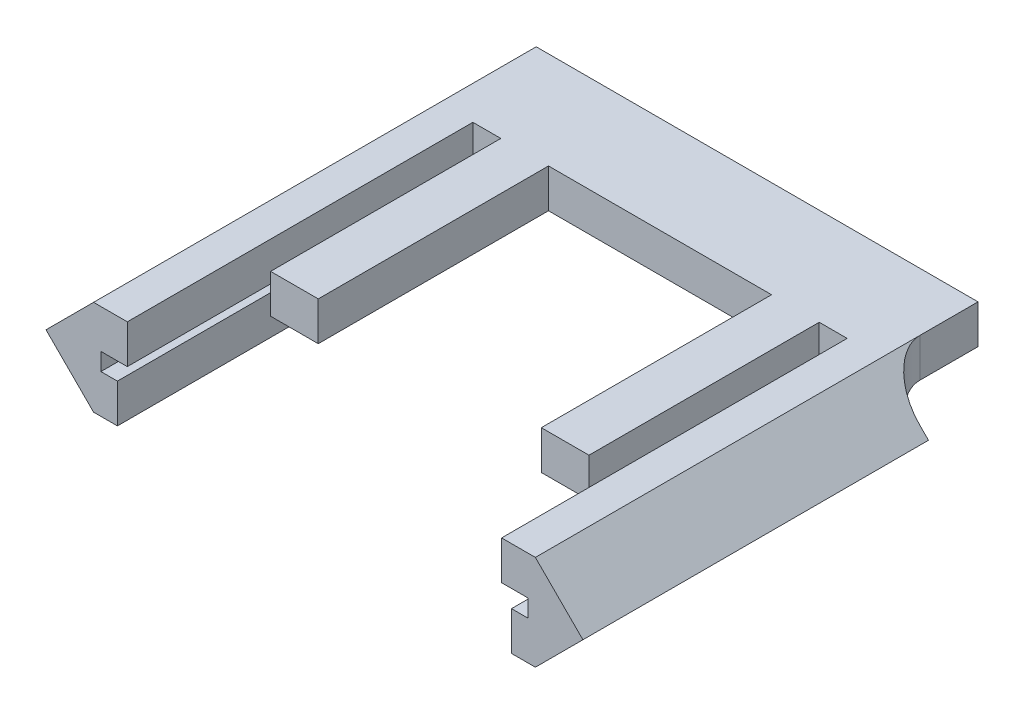
ISO-10303-21;
HEADER;
FILE_DESCRIPTION(('STEP AP214'),'2;1');
FILE_NAME('part.step','',(''),(''),'','','');
FILE_SCHEMA(('AUTOMOTIVE_DESIGN { 1 0 10303 214 1 1 1 1 }'));
ENDSEC;
DATA;
#1=APPLICATION_CONTEXT('core data for automotive mechanical design processes');
#2=APPLICATION_PROTOCOL_DEFINITION('international standard','automotive_design',2000,#1);
#3=PRODUCT_CONTEXT('',#1,'mechanical');
#4=PRODUCT('Part','Part','',(#3));
#5=PRODUCT_RELATED_PRODUCT_CATEGORY('part','',(#4));
#6=PRODUCT_DEFINITION_FORMATION('','',#4);
#7=PRODUCT_DEFINITION_CONTEXT('part definition',#1,'design');
#8=PRODUCT_DEFINITION('design','',#6,#7);
#9=PRODUCT_DEFINITION_SHAPE('','',#8);
#10=(LENGTH_UNIT() NAMED_UNIT(*) SI_UNIT(.MILLI.,.METRE.));
#11=(NAMED_UNIT(*) PLANE_ANGLE_UNIT() SI_UNIT($,.RADIAN.));
#12=(NAMED_UNIT(*) SI_UNIT($,.STERADIAN.) SOLID_ANGLE_UNIT());
#13=UNCERTAINTY_MEASURE_WITH_UNIT(LENGTH_MEASURE(1.E-05),#10,'distance_accuracy_value','');
#14=(GEOMETRIC_REPRESENTATION_CONTEXT(3) GLOBAL_UNCERTAINTY_ASSIGNED_CONTEXT((#13)) GLOBAL_UNIT_ASSIGNED_CONTEXT((#10,
#11,#12)) REPRESENTATION_CONTEXT('',''));
#15=CARTESIAN_POINT('',(0.,0.,0.));
#16=DIRECTION('',(0.,0.,1.));
#17=DIRECTION('',(1.,0.,0.));
#18=AXIS2_PLACEMENT_3D('',#15,#16,#17);
#19=CARTESIAN_POINT('',(0.,0.,0.));
#20=DIRECTION('',(0.,0.,-1.));
#21=DIRECTION('',(-1.,0.,0.));
#22=AXIS2_PLACEMENT_3D('',#19,#20,#21);
#23=PLANE('',#22);
#24=DIRECTION('',(0.,1.,0.));
#25=VECTOR('',#24,1.);
#26=CARTESIAN_POINT('',(26.289,0.,0.));
#27=LINE('',#26,#25);
#28=CARTESIAN_POINT('',(26.289,-2.54,0.));
#29=VERTEX_POINT('',#28);
#30=CARTESIAN_POINT('',(26.289,-1.397,0.));
#31=VERTEX_POINT('',#30);
#32=EDGE_CURVE('E240',#29,#31,#27,.T.);
#33=ORIENTED_EDGE('',*,*,#32,.T.);
#34=DIRECTION('',(-1.,0.,0.));
#35=VECTOR('',#34,1.);
#36=CARTESIAN_POINT('',(27.8491024484277,-1.397,0.));
#37=LINE('',#36,#35);
#38=CARTESIAN_POINT('',(28.9921024484277,-1.397,0.));
#39=VERTEX_POINT('',#38);
#40=EDGE_CURVE('E228',#31,#39,#37,.F.);
#41=ORIENTED_EDGE('',*,*,#40,.T.);
#42=DIRECTION('',(0.707106781186547,0.707106781186548,0.));
#43=VECTOR('',#42,1.);
#44=CARTESIAN_POINT('',(27.8491024484277,-2.54,0.));
#45=LINE('',#44,#43);
#46=CARTESIAN_POINT('',(27.8491024484277,-2.54,0.));
#47=VERTEX_POINT('',#46);
#48=EDGE_CURVE('E277',#47,#39,#45,.T.);
#49=ORIENTED_EDGE('',*,*,#48,.F.);
#50=DIRECTION('',(1.,0.,0.));
#51=VECTOR('',#50,1.);
#52=CARTESIAN_POINT('',(25.9715,-2.54,0.));
#53=LINE('',#52,#51);
#54=EDGE_CURVE('E295',#29,#47,#53,.T.);
#55=ORIENTED_EDGE('',*,*,#54,.F.);
#56=EDGE_LOOP('',(#33,#41,#49,#55));
#57=FACE_BOUND('',#56,.T.);
#58=ADVANCED_FACE('F34',(#57),#23,.T.);
#59=DIRECTION('',(0.707106781186548,-0.707106781186547,0.));
#60=VECTOR('',#59,1.);
#61=CARTESIAN_POINT('',(-1.05210244842766,-2.54,0.));
#62=LINE('',#61,#60);
#63=CARTESIAN_POINT('',(-2.19510244842766,-1.397,0.));
#64=VERTEX_POINT('',#63);
#65=CARTESIAN_POINT('',(-1.05210244842766,-2.54,0.));
#66=VERTEX_POINT('',#65);
#67=EDGE_CURVE('E208',#64,#66,#62,.T.);
#68=ORIENTED_EDGE('',*,*,#67,.F.);
#69=DIRECTION('',(-1.,0.,0.));
#70=VECTOR('',#69,1.);
#71=CARTESIAN_POINT('',(-0.571500000000003,-1.397,0.));
#72=LINE('',#71,#70);
#73=CARTESIAN_POINT('',(0.507999999999999,-1.397,0.));
#74=VERTEX_POINT('',#73);
#75=EDGE_CURVE('E86',#64,#74,#72,.F.);
#76=ORIENTED_EDGE('',*,*,#75,.T.);
#77=DIRECTION('',(0.,-1.,0.));
#78=VECTOR('',#77,1.);
#79=CARTESIAN_POINT('',(0.508,0.,0.));
#80=LINE('',#79,#78);
#81=CARTESIAN_POINT('',(0.507999999999998,-2.54,0.));
#82=VERTEX_POINT('',#81);
#83=EDGE_CURVE('E236',#74,#82,#80,.T.);
#84=ORIENTED_EDGE('',*,*,#83,.T.);
#85=EDGE_CURVE('E214',#66,#82,#53,.T.);
#86=ORIENTED_EDGE('',*,*,#85,.F.);
#87=EDGE_LOOP('',(#68,#76,#84,#86));
#88=FACE_BOUND('',#87,.T.);
#89=ADVANCED_FACE('F212',(#88),#23,.T.);
#90=CARTESIAN_POINT('',(30.9606024484277,0.571499999999999,22.606));
#91=DIRECTION('',(-0.707106781186548,-0.707106781186547,0.));
#92=DIRECTION('',(0.707106781186547,-0.707106781186548,0.));
#93=AXIS2_PLACEMENT_3D('',#90,#91,#92);
#94=PLANE('',#93);
#95=DIRECTION('',(-0.707106781186547,0.707106781186548,0.));
#96=VECTOR('',#95,1.);
#97=CARTESIAN_POINT('',(27.8491024484277,3.683,0.));
#98=LINE('',#97,#96);
#99=CARTESIAN_POINT('',(30.9606024484277,0.571499999999999,0.));
#100=VERTEX_POINT('',#99);
#101=CARTESIAN_POINT('',(30.3891024484277,1.143,0.));
#102=VERTEX_POINT('',#101);
#103=EDGE_CURVE('E372',#100,#102,#98,.T.);
#104=ORIENTED_EDGE('',*,*,#103,.T.);
#105=CARTESIAN_POINT('',(30.3891024484277,1.143,-2.54));
#106=DIRECTION('',(-0.707106781186548,-0.707106781186547,0.));
#107=DIRECTION('',(0.707106781186547,-0.707106781186548,0.));
#108=AXIS2_PLACEMENT_3D('',#105,#106,#107);
#109=ELLIPSE('',#108,3.59210244842766,2.54);
#110=CARTESIAN_POINT('',(27.8491024484277,3.683,-2.54));
#111=VERTEX_POINT('',#110);
#112=EDGE_CURVE('E12',#102,#111,#109,.T.);
#113=ORIENTED_EDGE('',*,*,#112,.T.);
#114=DIRECTION('',(0.,0.,-1.));
#115=VECTOR('',#114,1.);
#116=CARTESIAN_POINT('',(27.8491024484277,3.683,22.606));
#117=LINE('',#116,#115);
#118=CARTESIAN_POINT('',(27.8491024484277,3.683,22.606));
#119=VERTEX_POINT('',#118);
#120=EDGE_CURVE('E51',#119,#111,#117,.T.);
#121=ORIENTED_EDGE('',*,*,#120,.F.);
#122=DIRECTION('',(-0.707106781186547,0.707106781186548,0.));
#123=VECTOR('',#122,1.);
#124=CARTESIAN_POINT('',(30.9606024484277,0.571499999999999,22.606));
#125=LINE('',#124,#123);
#126=CARTESIAN_POINT('',(30.9606024484277,0.571499999999999,22.606));
#127=VERTEX_POINT('',#126);
#128=EDGE_CURVE('E284',#127,#119,#125,.T.);
#129=ORIENTED_EDGE('',*,*,#128,.F.);
#130=DIRECTION('',(0.,0.,-1.));
#131=VECTOR('',#130,1.);
#132=CARTESIAN_POINT('',(30.9606024484277,0.571499999999999,22.606));
#133=LINE('',#132,#131);
#134=EDGE_CURVE('E304',#127,#100,#133,.T.);
#135=ORIENTED_EDGE('',*,*,#134,.T.);
#136=EDGE_LOOP('',(#104,#113,#121,#129,#135));
#137=FACE_BOUND('',#136,.T.);
#138=ADVANCED_FACE('F607',(#137),#94,.F.);
#139=CARTESIAN_POINT('',(-4.16360244842766,0.571499999999995,22.606));
#140=DIRECTION('',(0.707106781186548,-0.707106781186547,0.));
#141=DIRECTION('',(0.707106781186547,0.707106781186548,0.));
#142=AXIS2_PLACEMENT_3D('',#139,#140,#141);
#143=PLANE('',#142);
#144=DIRECTION('',(0.,0.,-1.));
#145=VECTOR('',#144,1.);
#146=CARTESIAN_POINT('',(-1.05210244842766,3.683,22.606));
#147=LINE('',#146,#145);
#148=CARTESIAN_POINT('',(-1.05210244842766,3.683,22.606));
#149=VERTEX_POINT('',#148);
#150=CARTESIAN_POINT('',(-1.05210244842766,3.683,-2.53999999999999));
#151=VERTEX_POINT('',#150);
#152=EDGE_CURVE('E74',#149,#151,#147,.T.);
#153=ORIENTED_EDGE('',*,*,#152,.T.);
#154=CARTESIAN_POINT('',(-3.59210244842766,1.143,-2.54));
#155=DIRECTION('',(0.707106781186548,-0.707106781186547,0.));
#156=DIRECTION('',(0.707106781186547,0.707106781186548,0.));
#157=AXIS2_PLACEMENT_3D('',#154,#155,#156);
#158=ELLIPSE('',#157,3.59210244842766,2.54);
#159=CARTESIAN_POINT('',(-3.59210244842766,1.14300000000001,0.));
#160=VERTEX_POINT('',#159);
#161=EDGE_CURVE('E142',#151,#160,#158,.T.);
#162=ORIENTED_EDGE('',*,*,#161,.T.);
#163=DIRECTION('',(-0.707106781186548,-0.707106781186547,0.));
#164=VECTOR('',#163,1.);
#165=CARTESIAN_POINT('',(-1.05210244842766,3.683,0.));
#166=LINE('',#165,#164);
#167=CARTESIAN_POINT('',(-4.16360244842766,0.571499999999999,0.));
#168=VERTEX_POINT('',#167);
#169=EDGE_CURVE('E326',#160,#168,#166,.T.);
#170=ORIENTED_EDGE('',*,*,#169,.T.);
#171=DIRECTION('',(0.,0.,-1.));
#172=VECTOR('',#171,1.);
#173=CARTESIAN_POINT('',(-4.16360244842766,0.571499999999995,22.606));
#174=LINE('',#173,#172);
#175=CARTESIAN_POINT('',(-4.16360244842766,0.571499999999995,22.606));
#176=VERTEX_POINT('',#175);
#177=EDGE_CURVE('E293',#176,#168,#174,.T.);
#178=ORIENTED_EDGE('',*,*,#177,.F.);
#179=DIRECTION('',(-0.707106781186547,-0.707106781186548,0.));
#180=VECTOR('',#179,1.);
#181=CARTESIAN_POINT('',(-4.16360244842766,0.571499999999995,22.606));
#182=LINE('',#181,#180);
#183=EDGE_CURVE('E291',#149,#176,#182,.T.);
#184=ORIENTED_EDGE('',*,*,#183,.F.);
#185=EDGE_LOOP('',(#153,#162,#170,#178,#184));
#186=FACE_BOUND('',#185,.T.);
#187=ADVANCED_FACE('F583',(#186),#143,.F.);
#188=CARTESIAN_POINT('',(27.3685,1.143,22.606));
#189=DIRECTION('',(-1.,0.,0.));
#190=DIRECTION('',(0.,0.,1.));
#191=AXIS2_PLACEMENT_3D('',#188,#189,#190);
#192=PLANE('',#191);
#193=DIRECTION('',(0.,0.,-1.));
#194=VECTOR('',#193,1.);
#195=CARTESIAN_POINT('',(27.3685,1.143,22.606));
#196=LINE('',#195,#194);
#197=CARTESIAN_POINT('',(27.3685,1.143,22.606));
#198=VERTEX_POINT('',#197);
#199=CARTESIAN_POINT('',(27.3685,1.143,-2.53999999999999));
#200=VERTEX_POINT('',#199);
#201=EDGE_CURVE('E270',#198,#200,#196,.T.);
#202=ORIENTED_EDGE('',*,*,#201,.T.);
#203=CARTESIAN_POINT('',(27.3685,-1.397,-2.54));
#204=DIRECTION('',(-1.,0.,0.));
#205=DIRECTION('',(0.,0.,1.));
#206=AXIS2_PLACEMENT_3D('',#203,#204,#205);
#207=CIRCLE('',#206,2.54);
#208=CARTESIAN_POINT('',(27.3685,0.,-0.418681777761751));
#209=VERTEX_POINT('',#208);
#210=EDGE_CURVE('E149',#200,#209,#207,.F.);
#211=ORIENTED_EDGE('',*,*,#210,.T.);
#212=DIRECTION('',(0.,0.,-1.));
#213=VECTOR('',#212,1.);
#214=CARTESIAN_POINT('',(27.3685,0.,22.606));
#215=LINE('',#214,#213);
#216=CARTESIAN_POINT('',(27.3685,0.,22.606));
#217=VERTEX_POINT('',#216);
#218=EDGE_CURVE('E217',#217,#209,#215,.T.);
#219=ORIENTED_EDGE('',*,*,#218,.F.);
#220=DIRECTION('',(0.,1.,0.));
#221=VECTOR('',#220,1.);
#222=CARTESIAN_POINT('',(27.3685,1.143,22.606));
#223=LINE('',#222,#221);
#224=EDGE_CURVE('E261',#217,#198,#223,.T.);
#225=ORIENTED_EDGE('',*,*,#224,.T.);
#226=EDGE_LOOP('',(#202,#211,#219,#225));
#227=FACE_BOUND('',#226,.T.);
#228=ADVANCED_FACE('F631',(#227),#192,.T.);
#229=CARTESIAN_POINT('',(-0.571500000000003,1.143,22.606));
#230=DIRECTION('',(1.,0.,0.));
#231=DIRECTION('',(0.,0.,-1.));
#232=AXIS2_PLACEMENT_3D('',#229,#230,#231);
#233=PLANE('',#232);
#234=DIRECTION('',(0.,0.,-1.));
#235=VECTOR('',#234,1.);
#236=CARTESIAN_POINT('',(-0.571500000000003,0.,22.606));
#237=LINE('',#236,#235);
#238=CARTESIAN_POINT('',(-0.571500000000003,0.,22.606));
#239=VERTEX_POINT('',#238);
#240=CARTESIAN_POINT('',(-0.571500000000003,0.,-0.418681777761751));
#241=VERTEX_POINT('',#240);
#242=EDGE_CURVE('E112',#239,#241,#237,.T.);
#243=ORIENTED_EDGE('',*,*,#242,.T.);
#244=CARTESIAN_POINT('',(-0.571500000000003,-1.397,-2.54));
#245=DIRECTION('',(1.,0.,0.));
#246=DIRECTION('',(0.,0.,-1.));
#247=AXIS2_PLACEMENT_3D('',#244,#245,#246);
#248=CIRCLE('',#247,2.54);
#249=CARTESIAN_POINT('',(-0.571500000000003,1.143,-2.53999999999999));
#250=VERTEX_POINT('',#249);
#251=EDGE_CURVE('E118',#241,#250,#248,.F.);
#252=ORIENTED_EDGE('',*,*,#251,.T.);
#253=DIRECTION('',(0.,0.,-1.));
#254=VECTOR('',#253,1.);
#255=CARTESIAN_POINT('',(-0.571500000000003,1.143,22.606));
#256=LINE('',#255,#254);
#257=CARTESIAN_POINT('',(-0.571500000000003,1.143,22.606));
#258=VERTEX_POINT('',#257);
#259=EDGE_CURVE('E126',#258,#250,#256,.T.);
#260=ORIENTED_EDGE('',*,*,#259,.F.);
#261=DIRECTION('',(0.,-1.,0.));
#262=VECTOR('',#261,1.);
#263=CARTESIAN_POINT('',(-0.571500000000003,1.143,22.606));
#264=LINE('',#263,#262);
#265=EDGE_CURVE('E122',#258,#239,#264,.T.);
#266=ORIENTED_EDGE('',*,*,#265,.T.);
#267=EDGE_LOOP('',(#243,#252,#260,#266));
#268=FACE_BOUND('',#267,.T.);
#269=ADVANCED_FACE('F114',(#268),#233,.T.);
#270=CARTESIAN_POINT('',(0.,0.,22.606));
#271=DIRECTION('',(0.,0.,-1.));
#272=DIRECTION('',(-1.,0.,0.));
#273=AXIS2_PLACEMENT_3D('',#270,#271,#272);
#274=PLANE('',#273);
#275=DIRECTION('',(-1.,0.,0.));
#276=VECTOR('',#275,1.);
#277=CARTESIAN_POINT('',(26.797,1.143,22.606));
#278=LINE('',#277,#276);
#279=CARTESIAN_POINT('',(1.1557,1.143,22.606));
#280=VERTEX_POINT('',#279);
#281=EDGE_CURVE('E264',#280,#258,#278,.T.);
#282=ORIENTED_EDGE('',*,*,#281,.F.);
#283=DIRECTION('',(0.,1.,0.));
#284=VECTOR('',#283,1.);
#285=CARTESIAN_POINT('',(1.1557,1.143,22.606));
#286=LINE('',#285,#284);
#287=CARTESIAN_POINT('',(1.1557,3.683,22.606));
#288=VERTEX_POINT('',#287);
#289=EDGE_CURVE('E367',#280,#288,#286,.T.);
#290=ORIENTED_EDGE('',*,*,#289,.T.);
#291=DIRECTION('',(-1.,0.,0.));
#292=VECTOR('',#291,1.);
#293=CARTESIAN_POINT('',(25.9715,3.683,22.606));
#294=LINE('',#293,#292);
#295=EDGE_CURVE('E287',#288,#149,#294,.T.);
#296=ORIENTED_EDGE('',*,*,#295,.T.);
#297=ORIENTED_EDGE('',*,*,#183,.T.);
#298=DIRECTION('',(0.707106781186548,-0.707106781186547,0.));
#299=VECTOR('',#298,1.);
#300=CARTESIAN_POINT('',(-1.05210244842766,-2.54,22.606));
#301=LINE('',#300,#299);
#302=CARTESIAN_POINT('',(-1.05210244842766,-2.54,22.606));
#303=VERTEX_POINT('',#302);
#304=EDGE_CURVE('E273',#176,#303,#301,.T.);
#305=ORIENTED_EDGE('',*,*,#304,.T.);
#306=DIRECTION('',(1.,0.,0.));
#307=VECTOR('',#306,1.);
#308=CARTESIAN_POINT('',(0.825500000000002,-2.54,22.606));
#309=LINE('',#308,#307);
#310=CARTESIAN_POINT('',(0.507999999999998,-2.54,22.606));
#311=VERTEX_POINT('',#310);
#312=EDGE_CURVE('E278',#303,#311,#309,.T.);
#313=ORIENTED_EDGE('',*,*,#312,.T.);
#314=DIRECTION('',(0.,-1.,0.));
#315=VECTOR('',#314,1.);
#316=CARTESIAN_POINT('',(0.508,0.,22.606));
#317=LINE('',#316,#315);
#318=CARTESIAN_POINT('',(0.508,0.,22.606));
#319=VERTEX_POINT('',#318);
#320=EDGE_CURVE('E245',#319,#311,#317,.T.);
#321=ORIENTED_EDGE('',*,*,#320,.F.);
#322=DIRECTION('',(1.,0.,0.));
#323=VECTOR('',#322,1.);
#324=CARTESIAN_POINT('',(-0.571500000000003,0.,22.606));
#325=LINE('',#324,#323);
#326=EDGE_CURVE('E259',#239,#319,#325,.T.);
#327=ORIENTED_EDGE('',*,*,#326,.F.);
#328=ORIENTED_EDGE('',*,*,#265,.F.);
#329=EDGE_LOOP('',(#282,#290,#296,#297,#305,#313,#321,#327,#328));
#330=FACE_BOUND('',#329,.T.);
#331=ADVANCED_FACE('F618',(#330),#274,.F.);
#332=ORIENTED_EDGE('',*,*,#169,.F.);
#333=DIRECTION('',(0.,1.,0.));
#334=VECTOR('',#333,1.);
#335=CARTESIAN_POINT('',(-3.59210244842765,0.,0.));
#336=LINE('',#335,#334);
#337=CARTESIAN_POINT('',(-3.59210244842765,0.,0.));
#338=VERTEX_POINT('',#337);
#339=EDGE_CURVE('E220',#160,#338,#336,.F.);
#340=ORIENTED_EDGE('',*,*,#339,.T.);
#341=EDGE_CURVE('E216',#168,#338,#62,.T.);
#342=ORIENTED_EDGE('',*,*,#341,.F.);
#343=EDGE_LOOP('',(#332,#340,#342));
#344=FACE_BOUND('',#343,.T.);
#345=ADVANCED_FACE('F588',(#344),#23,.T.);
#346=CARTESIAN_POINT('',(25.9715,-2.54,22.606));
#347=DIRECTION('',(0.,1.,0.));
#348=DIRECTION('',(0.,0.,1.));
#349=AXIS2_PLACEMENT_3D('',#346,#347,#348);
#350=PLANE('',#349);
#351=ORIENTED_EDGE('',*,*,#85,.T.);
#352=DIRECTION('',(0.,0.,1.));
#353=VECTOR('',#352,1.);
#354=CARTESIAN_POINT('',(0.507999999999998,-2.54,0.));
#355=LINE('',#354,#353);
#356=EDGE_CURVE('E239',#82,#311,#355,.T.);
#357=ORIENTED_EDGE('',*,*,#356,.T.);
#358=ORIENTED_EDGE('',*,*,#312,.F.);
#359=DIRECTION('',(0.,0.,-1.));
#360=VECTOR('',#359,1.);
#361=CARTESIAN_POINT('',(-1.05210244842766,-2.54,22.606));
#362=LINE('',#361,#360);
#363=EDGE_CURVE('E310',#303,#66,#362,.T.);
#364=ORIENTED_EDGE('',*,*,#363,.T.);
#365=EDGE_LOOP('',(#351,#357,#358,#364));
#366=FACE_BOUND('',#365,.T.);
#367=ADVANCED_FACE('F620',(#366),#350,.F.);
#368=CARTESIAN_POINT('',(27.3685,0.,22.606));
#369=DIRECTION('',(0.,1.,0.));
#370=DIRECTION('',(0.,0.,1.));
#371=AXIS2_PLACEMENT_3D('',#368,#369,#370);
#372=PLANE('',#371);
#373=DIRECTION('',(0.,0.,1.));
#374=VECTOR('',#373,1.);
#375=CARTESIAN_POINT('',(0.508,0.,0.));
#376=LINE('',#375,#374);
#377=CARTESIAN_POINT('',(0.508,0.,-0.418681777761759));
#378=VERTEX_POINT('',#377);
#379=EDGE_CURVE('E132',#378,#319,#376,.T.);
#380=ORIENTED_EDGE('',*,*,#379,.F.);
#381=DIRECTION('',(1.,0.,0.));
#382=VECTOR('',#381,1.);
#383=CARTESIAN_POINT('',(0.508,0.,-0.418681777761759));
#384=LINE('',#383,#382);
#385=EDGE_CURVE('E129',#378,#241,#384,.F.);
#386=ORIENTED_EDGE('',*,*,#385,.T.);
#387=ORIENTED_EDGE('',*,*,#242,.F.);
#388=ORIENTED_EDGE('',*,*,#326,.T.);
#389=EDGE_LOOP('',(#380,#386,#387,#388));
#390=FACE_BOUND('',#389,.T.);
#391=ADVANCED_FACE('F130',(#390),#372,.T.);
#392=CARTESIAN_POINT('',(25.6413,3.683,22.606));
#393=VERTEX_POINT('',#392);
#394=EDGE_CURVE('E288',#119,#393,#294,.T.);
#395=ORIENTED_EDGE('',*,*,#394,.T.);
#396=DIRECTION('',(0.,1.,0.));
#397=VECTOR('',#396,1.);
#398=CARTESIAN_POINT('',(25.6413,1.143,22.606));
#399=LINE('',#398,#397);
#400=CARTESIAN_POINT('',(25.6413,1.143,22.606));
#401=VERTEX_POINT('',#400);
#402=EDGE_CURVE('E432',#401,#393,#399,.T.);
#403=ORIENTED_EDGE('',*,*,#402,.F.);
#404=EDGE_CURVE('E265',#198,#401,#278,.T.);
#405=ORIENTED_EDGE('',*,*,#404,.F.);
#406=ORIENTED_EDGE('',*,*,#224,.F.);
#407=CARTESIAN_POINT('',(26.289,0.,22.606));
#408=VERTEX_POINT('',#407);
#409=EDGE_CURVE('E253',#408,#217,#325,.T.);
#410=ORIENTED_EDGE('',*,*,#409,.F.);
#411=DIRECTION('',(0.,1.,0.));
#412=VECTOR('',#411,1.);
#413=CARTESIAN_POINT('',(26.289,0.,22.606));
#414=LINE('',#413,#412);
#415=CARTESIAN_POINT('',(26.289,-2.54,22.606));
#416=VERTEX_POINT('',#415);
#417=EDGE_CURVE('E241',#416,#408,#414,.T.);
#418=ORIENTED_EDGE('',*,*,#417,.F.);
#419=CARTESIAN_POINT('',(27.8491024484277,-2.54,22.606));
#420=VERTEX_POINT('',#419);
#421=EDGE_CURVE('E276',#416,#420,#309,.T.);
#422=ORIENTED_EDGE('',*,*,#421,.T.);
#423=DIRECTION('',(0.707106781186547,0.707106781186548,0.));
#424=VECTOR('',#423,1.);
#425=CARTESIAN_POINT('',(27.8491024484277,-2.54,22.606));
#426=LINE('',#425,#424);
#427=EDGE_CURVE('E281',#420,#127,#426,.T.);
#428=ORIENTED_EDGE('',*,*,#427,.T.);
#429=ORIENTED_EDGE('',*,*,#128,.T.);
#430=EDGE_LOOP('',(#395,#403,#405,#406,#410,#418,#422,#428,#429));
#431=FACE_BOUND('',#430,.T.);
#432=ADVANCED_FACE('F518',(#431),#274,.F.);
#433=CARTESIAN_POINT('',(30.3891024484277,0.,0.));
#434=VERTEX_POINT('',#433);
#435=EDGE_CURVE('E297',#434,#100,#45,.T.);
#436=ORIENTED_EDGE('',*,*,#435,.F.);
#437=DIRECTION('',(0.,-1.,0.));
#438=VECTOR('',#437,1.);
#439=CARTESIAN_POINT('',(30.3891024484277,0.,0.));
#440=LINE('',#439,#438);
#441=EDGE_CURVE('E222',#434,#102,#440,.F.);
#442=ORIENTED_EDGE('',*,*,#441,.T.);
#443=ORIENTED_EDGE('',*,*,#103,.F.);
#444=EDGE_LOOP('',(#436,#442,#443));
#445=FACE_BOUND('',#444,.T.);
#446=ADVANCED_FACE('F603',(#445),#23,.T.);
#447=CARTESIAN_POINT('',(-1.05210244842766,-2.54,22.606));
#448=DIRECTION('',(0.707106781186547,0.707106781186548,0.));
#449=DIRECTION('',(-0.707106781186548,0.707106781186547,0.));
#450=AXIS2_PLACEMENT_3D('',#447,#448,#449);
#451=PLANE('',#450);
#452=ORIENTED_EDGE('',*,*,#341,.T.);
#453=CARTESIAN_POINT('',(-3.59210244842765,0.,-2.54));
#454=DIRECTION('',(0.707106781186547,0.707106781186548,0.));
#455=DIRECTION('',(-0.707106781186548,0.707106781186547,0.));
#456=AXIS2_PLACEMENT_3D('',#453,#454,#455);
#457=ELLIPSE('',#456,3.59210244842767,2.54);
#458=CARTESIAN_POINT('',(-2.89360244842766,-0.698500000000003,-0.0979316655752645));
#459=VERTEX_POINT('',#458);
#460=EDGE_CURVE('E144',#338,#459,#457,.T.);
#461=ORIENTED_EDGE('',*,*,#460,.T.);
#462=CARTESIAN_POINT('',(-2.19510244842766,-1.397,-2.54));
#463=DIRECTION('',(0.707106781186547,0.707106781186548,0.));
#464=DIRECTION('',(0.707106781186548,-0.707106781186547,0.));
#465=AXIS2_PLACEMENT_3D('',#462,#463,#464);
#466=ELLIPSE('',#465,3.59210244842766,2.54);
#467=EDGE_CURVE('E203',#459,#64,#466,.T.);
#468=ORIENTED_EDGE('',*,*,#467,.T.);
#469=ORIENTED_EDGE('',*,*,#67,.T.);
#470=ORIENTED_EDGE('',*,*,#363,.F.);
#471=ORIENTED_EDGE('',*,*,#304,.F.);
#472=ORIENTED_EDGE('',*,*,#177,.T.);
#473=EDGE_LOOP('',(#452,#461,#468,#469,#470,#471,#472));
#474=FACE_BOUND('',#473,.T.);
#475=ADVANCED_FACE('F205',(#474),#451,.F.);
#476=ORIENTED_EDGE('',*,*,#421,.F.);
#477=DIRECTION('',(0.,0.,1.));
#478=VECTOR('',#477,1.);
#479=CARTESIAN_POINT('',(26.289,-2.54,0.));
#480=LINE('',#479,#478);
#481=EDGE_CURVE('E255',#29,#416,#480,.T.);
#482=ORIENTED_EDGE('',*,*,#481,.F.);
#483=ORIENTED_EDGE('',*,*,#54,.T.);
#484=DIRECTION('',(0.,0.,-1.));
#485=VECTOR('',#484,1.);
#486=CARTESIAN_POINT('',(27.8491024484277,-2.54,22.606));
#487=LINE('',#486,#485);
#488=EDGE_CURVE('E307',#420,#47,#487,.T.);
#489=ORIENTED_EDGE('',*,*,#488,.F.);
#490=EDGE_LOOP('',(#476,#482,#483,#489));
#491=FACE_BOUND('',#490,.T.);
#492=ADVANCED_FACE('F616',(#491),#350,.F.);
#493=CARTESIAN_POINT('',(27.8491024484277,-2.54,22.606));
#494=DIRECTION('',(-0.707106781186548,0.707106781186547,0.));
#495=DIRECTION('',(-0.707106781186547,-0.707106781186548,0.));
#496=AXIS2_PLACEMENT_3D('',#493,#494,#495);
#497=PLANE('',#496);
#498=ORIENTED_EDGE('',*,*,#48,.T.);
#499=CARTESIAN_POINT('',(28.9921024484277,-1.397,-2.54));
#500=DIRECTION('',(-0.707106781186548,0.707106781186547,0.));
#501=DIRECTION('',(0.707106781186547,0.707106781186548,0.));
#502=AXIS2_PLACEMENT_3D('',#499,#500,#501);
#503=ELLIPSE('',#502,3.59210244842766,2.54);
#504=CARTESIAN_POINT('',(29.6906024484277,-0.698500000000004,-0.0979316655752641));
#505=VERTEX_POINT('',#504);
#506=EDGE_CURVE('E156',#39,#505,#503,.T.);
#507=ORIENTED_EDGE('',*,*,#506,.T.);
#508=CARTESIAN_POINT('',(30.3891024484277,0.,-2.54));
#509=DIRECTION('',(-0.707106781186548,0.707106781186547,0.));
#510=DIRECTION('',(-0.707106781186547,-0.707106781186548,0.));
#511=AXIS2_PLACEMENT_3D('',#508,#509,#510);
#512=ELLIPSE('',#511,3.59210244842767,2.54);
#513=EDGE_CURVE('E43',#505,#434,#512,.T.);
#514=ORIENTED_EDGE('',*,*,#513,.T.);
#515=ORIENTED_EDGE('',*,*,#435,.T.);
#516=ORIENTED_EDGE('',*,*,#134,.F.);
#517=ORIENTED_EDGE('',*,*,#427,.F.);
#518=ORIENTED_EDGE('',*,*,#488,.T.);
#519=EDGE_LOOP('',(#498,#507,#514,#515,#516,#517,#518));
#520=FACE_BOUND('',#519,.T.);
#521=ADVANCED_FACE('F804',(#520),#497,.F.);
#522=CARTESIAN_POINT('',(0.825499999999998,3.683,22.606));
#523=DIRECTION('',(0.,-1.,0.));
#524=DIRECTION('',(1.,0.,0.));
#525=AXIS2_PLACEMENT_3D('',#522,#523,#524);
#526=PLANE('',#525);
#527=ORIENTED_EDGE('',*,*,#295,.F.);
#528=DIRECTION('',(0.,0.,1.));
#529=VECTOR('',#528,1.);
#530=CARTESIAN_POINT('',(1.1557,3.683,0.));
#531=LINE('',#530,#529);
#532=CARTESIAN_POINT('',(1.1557,3.683,0.));
#533=VERTEX_POINT('',#532);
#534=EDGE_CURVE('E368',#533,#288,#531,.T.);
#535=ORIENTED_EDGE('',*,*,#534,.F.);
#536=DIRECTION('',(-1.,0.,0.));
#537=VECTOR('',#536,1.);
#538=CARTESIAN_POINT('',(2.9845,3.683,0.));
#539=LINE('',#538,#537);
#540=CARTESIAN_POINT('',(2.9845,3.683,0.));
#541=VERTEX_POINT('',#540);
#542=EDGE_CURVE('E337',#541,#533,#539,.T.);
#543=ORIENTED_EDGE('',*,*,#542,.F.);
#544=DIRECTION('',(0.,0.,-1.));
#545=VECTOR('',#544,1.);
#546=CARTESIAN_POINT('',(2.9845,3.683,15.0622));
#547=LINE('',#546,#545);
#548=CARTESIAN_POINT('',(2.9845,3.683,15.0622));
#549=VERTEX_POINT('',#548);
#550=EDGE_CURVE('E396',#549,#541,#547,.T.);
#551=ORIENTED_EDGE('',*,*,#550,.F.);
#552=DIRECTION('',(-1.,0.,0.));
#553=VECTOR('',#552,1.);
#554=CARTESIAN_POINT('',(6.10235,3.683,15.0622));
#555=LINE('',#554,#553);
#556=CARTESIAN_POINT('',(6.10235,3.683,15.0622));
#557=VERTEX_POINT('',#556);
#558=EDGE_CURVE('E393',#557,#549,#555,.T.);
#559=ORIENTED_EDGE('',*,*,#558,.F.);
#560=DIRECTION('',(0.,0.,1.));
#561=VECTOR('',#560,1.);
#562=CARTESIAN_POINT('',(6.10235,3.683,0.));
#563=LINE('',#562,#561);
#564=CARTESIAN_POINT('',(6.10235,3.683,0.));
#565=VERTEX_POINT('',#564);
#566=EDGE_CURVE('E390',#565,#557,#563,.T.);
#567=ORIENTED_EDGE('',*,*,#566,.F.);
#568=DIRECTION('',(-1.,0.,0.));
#569=VECTOR('',#568,1.);
#570=CARTESIAN_POINT('',(6.10235,3.683,0.));
#571=LINE('',#570,#569);
#572=CARTESIAN_POINT('',(20.69465,3.683,0.));
#573=VERTEX_POINT('',#572);
#574=EDGE_CURVE('E387',#573,#565,#571,.T.);
#575=ORIENTED_EDGE('',*,*,#574,.F.);
#576=DIRECTION('',(0.,0.,-1.));
#577=VECTOR('',#576,1.);
#578=CARTESIAN_POINT('',(20.69465,3.683,0.));
#579=LINE('',#578,#577);
#580=CARTESIAN_POINT('',(20.69465,3.683,15.0622));
#581=VERTEX_POINT('',#580);
#582=EDGE_CURVE('E384',#581,#573,#579,.T.);
#583=ORIENTED_EDGE('',*,*,#582,.F.);
#584=DIRECTION('',(-1.,0.,0.));
#585=VECTOR('',#584,1.);
#586=CARTESIAN_POINT('',(23.8125,3.683,15.0622));
#587=LINE('',#586,#585);
#588=CARTESIAN_POINT('',(23.8125,3.683,15.0622));
#589=VERTEX_POINT('',#588);
#590=EDGE_CURVE('E381',#589,#581,#587,.T.);
#591=ORIENTED_EDGE('',*,*,#590,.F.);
#592=DIRECTION('',(0.,0.,1.));
#593=VECTOR('',#592,1.);
#594=CARTESIAN_POINT('',(23.8125,3.683,0.));
#595=LINE('',#594,#593);
#596=CARTESIAN_POINT('',(23.8125,3.683,0.));
#597=VERTEX_POINT('',#596);
#598=EDGE_CURVE('E378',#597,#589,#595,.T.);
#599=ORIENTED_EDGE('',*,*,#598,.F.);
#600=DIRECTION('',(-1.,0.,0.));
#601=VECTOR('',#600,1.);
#602=CARTESIAN_POINT('',(25.6413,3.683,0.));
#603=LINE('',#602,#601);
#604=CARTESIAN_POINT('',(25.6413,3.683,0.));
#605=VERTEX_POINT('',#604);
#606=EDGE_CURVE('E375',#605,#597,#603,.T.);
#607=ORIENTED_EDGE('',*,*,#606,.F.);
#608=DIRECTION('',(0.,0.,-1.));
#609=VECTOR('',#608,1.);
#610=CARTESIAN_POINT('',(25.6413,3.683,22.606));
#611=LINE('',#610,#609);
#612=EDGE_CURVE('E371',#393,#605,#611,.T.);
#613=ORIENTED_EDGE('',*,*,#612,.F.);
#614=ORIENTED_EDGE('',*,*,#394,.F.);
#615=ORIENTED_EDGE('',*,*,#120,.T.);
#616=DIRECTION('',(0.,0.,-1.));
#617=VECTOR('',#616,1.);
#618=CARTESIAN_POINT('',(27.8491024484277,3.683,4.75232913948518));
#619=LINE('',#618,#617);
#620=CARTESIAN_POINT('',(27.8491024484277,3.683,-6.35));
#621=VERTEX_POINT('',#620);
#622=EDGE_CURVE('E450',#111,#621,#619,.T.);
#623=ORIENTED_EDGE('',*,*,#622,.T.);
#624=DIRECTION('',(1.,0.,0.));
#625=VECTOR('',#624,1.);
#626=CARTESIAN_POINT('',(-1.05210244842766,3.683,-6.35));
#627=LINE('',#626,#625);
#628=CARTESIAN_POINT('',(-1.05210244842766,3.683,-6.35));
#629=VERTEX_POINT('',#628);
#630=EDGE_CURVE('E248',#629,#621,#627,.T.);
#631=ORIENTED_EDGE('',*,*,#630,.F.);
#632=DIRECTION('',(0.,0.,-1.));
#633=VECTOR('',#632,1.);
#634=CARTESIAN_POINT('',(-1.05210244842766,3.683,4.75232913948518));
#635=LINE('',#634,#633);
#636=EDGE_CURVE('E165',#151,#629,#635,.T.);
#637=ORIENTED_EDGE('',*,*,#636,.F.);
#638=ORIENTED_EDGE('',*,*,#152,.F.);
#639=EDGE_LOOP('',(#527,#535,#543,#551,#559,#567,#575,#583,#591,#599,#607,#613,#614,#615,#623,
#631,#637,#638));
#640=FACE_BOUND('',#639,.T.);
#641=ADVANCED_FACE('F448',(#640),#526,.F.);
#642=DIRECTION('',(0.,0.,1.));
#643=VECTOR('',#642,1.);
#644=CARTESIAN_POINT('',(26.289,0.,0.));
#645=LINE('',#644,#643);
#646=CARTESIAN_POINT('',(26.289,0.,-0.418681777761759));
#647=VERTEX_POINT('',#646);
#648=EDGE_CURVE('E60',#647,#408,#645,.T.);
#649=ORIENTED_EDGE('',*,*,#648,.T.);
#650=ORIENTED_EDGE('',*,*,#409,.T.);
#651=ORIENTED_EDGE('',*,*,#218,.T.);
#652=DIRECTION('',(1.,0.,0.));
#653=VECTOR('',#652,1.);
#654=CARTESIAN_POINT('',(27.3685,0.,-0.418681777761759));
#655=LINE('',#654,#653);
#656=EDGE_CURVE('E152',#209,#647,#655,.F.);
#657=ORIENTED_EDGE('',*,*,#656,.T.);
#658=EDGE_LOOP('',(#649,#650,#651,#657));
#659=FACE_BOUND('',#658,.T.);
#660=ADVANCED_FACE('F635',(#659),#372,.T.);
#661=CARTESIAN_POINT('',(0.,1.143,22.606));
#662=DIRECTION('',(0.,-1.,0.));
#663=DIRECTION('',(0.,0.,-1.));
#664=AXIS2_PLACEMENT_3D('',#661,#662,#663);
#665=PLANE('',#664);
#666=ORIENTED_EDGE('',*,*,#259,.T.);
#667=DIRECTION('',(-1.,0.,0.));
#668=VECTOR('',#667,1.);
#669=CARTESIAN_POINT('',(-1.05210244842766,1.143,-2.54));
#670=LINE('',#669,#668);
#671=CARTESIAN_POINT('',(-1.05210244842766,1.143,-2.54));
#672=VERTEX_POINT('',#671);
#673=EDGE_CURVE('E141',#250,#672,#670,.T.);
#674=ORIENTED_EDGE('',*,*,#673,.T.);
#675=DIRECTION('',(0.,0.,-1.));
#676=VECTOR('',#675,1.);
#677=CARTESIAN_POINT('',(-1.05210244842766,1.143,4.75232913948518));
#678=LINE('',#677,#676);
#679=CARTESIAN_POINT('',(-1.05210244842766,1.143,-6.35));
#680=VERTEX_POINT('',#679);
#681=EDGE_CURVE('E318',#672,#680,#678,.T.);
#682=ORIENTED_EDGE('',*,*,#681,.T.);
#683=DIRECTION('',(-1.,0.,0.));
#684=VECTOR('',#683,1.);
#685=CARTESIAN_POINT('',(27.3685,1.143,-6.35));
#686=LINE('',#685,#684);
#687=CARTESIAN_POINT('',(27.8491024484277,1.143,-6.35));
#688=VERTEX_POINT('',#687);
#689=EDGE_CURVE('E404',#688,#680,#686,.T.);
#690=ORIENTED_EDGE('',*,*,#689,.F.);
#691=DIRECTION('',(0.,0.,-1.));
#692=VECTOR('',#691,1.);
#693=CARTESIAN_POINT('',(27.8491024484277,1.143,4.75232913948518));
#694=LINE('',#693,#692);
#695=CARTESIAN_POINT('',(27.8491024484277,1.143,-2.54));
#696=VERTEX_POINT('',#695);
#697=EDGE_CURVE('E993',#696,#688,#694,.T.);
#698=ORIENTED_EDGE('',*,*,#697,.F.);
#699=DIRECTION('',(-1.,0.,0.));
#700=VECTOR('',#699,1.);
#701=CARTESIAN_POINT('',(27.3685,1.143,-2.54));
#702=LINE('',#701,#700);
#703=EDGE_CURVE('E177',#696,#200,#702,.T.);
#704=ORIENTED_EDGE('',*,*,#703,.T.);
#705=ORIENTED_EDGE('',*,*,#201,.F.);
#706=ORIENTED_EDGE('',*,*,#404,.T.);
#707=DIRECTION('',(0.,0.,-1.));
#708=VECTOR('',#707,1.);
#709=CARTESIAN_POINT('',(25.6413,1.143,22.606));
#710=LINE('',#709,#708);
#711=CARTESIAN_POINT('',(25.6413,1.143,0.));
#712=VERTEX_POINT('',#711);
#713=EDGE_CURVE('E336',#401,#712,#710,.T.);
#714=ORIENTED_EDGE('',*,*,#713,.T.);
#715=DIRECTION('',(-1.,0.,0.));
#716=VECTOR('',#715,1.);
#717=CARTESIAN_POINT('',(25.6413,1.143,0.));
#718=LINE('',#717,#716);
#719=CARTESIAN_POINT('',(23.8125,1.143,0.));
#720=VERTEX_POINT('',#719);
#721=EDGE_CURVE('E340',#712,#720,#718,.T.);
#722=ORIENTED_EDGE('',*,*,#721,.T.);
#723=DIRECTION('',(0.,0.,1.));
#724=VECTOR('',#723,1.);
#725=CARTESIAN_POINT('',(23.8125,1.143,0.));
#726=LINE('',#725,#724);
#727=CARTESIAN_POINT('',(23.8125,1.143,15.0622));
#728=VERTEX_POINT('',#727);
#729=EDGE_CURVE('E343',#720,#728,#726,.T.);
#730=ORIENTED_EDGE('',*,*,#729,.T.);
#731=DIRECTION('',(-1.,0.,0.));
#732=VECTOR('',#731,1.);
#733=CARTESIAN_POINT('',(23.8125,1.143,15.0622));
#734=LINE('',#733,#732);
#735=CARTESIAN_POINT('',(20.69465,1.143,15.0622));
#736=VERTEX_POINT('',#735);
#737=EDGE_CURVE('E346',#728,#736,#734,.T.);
#738=ORIENTED_EDGE('',*,*,#737,.T.);
#739=DIRECTION('',(0.,0.,-1.));
#740=VECTOR('',#739,1.);
#741=CARTESIAN_POINT('',(20.69465,1.143,0.));
#742=LINE('',#741,#740);
#743=CARTESIAN_POINT('',(20.69465,1.143,0.));
#744=VERTEX_POINT('',#743);
#745=EDGE_CURVE('E349',#736,#744,#742,.T.);
#746=ORIENTED_EDGE('',*,*,#745,.T.);
#747=DIRECTION('',(-1.,0.,0.));
#748=VECTOR('',#747,1.);
#749=CARTESIAN_POINT('',(6.10235,1.143,0.));
#750=LINE('',#749,#748);
#751=CARTESIAN_POINT('',(6.10235,1.143,0.));
#752=VERTEX_POINT('',#751);
#753=EDGE_CURVE('E352',#744,#752,#750,.T.);
#754=ORIENTED_EDGE('',*,*,#753,.T.);
#755=DIRECTION('',(0.,0.,1.));
#756=VECTOR('',#755,1.);
#757=CARTESIAN_POINT('',(6.10235,1.143,0.));
#758=LINE('',#757,#756);
#759=CARTESIAN_POINT('',(6.10235,1.143,15.0622));
#760=VERTEX_POINT('',#759);
#761=EDGE_CURVE('E355',#752,#760,#758,.T.);
#762=ORIENTED_EDGE('',*,*,#761,.T.);
#763=DIRECTION('',(-1.,0.,0.));
#764=VECTOR('',#763,1.);
#765=CARTESIAN_POINT('',(6.10235,1.143,15.0622));
#766=LINE('',#765,#764);
#767=CARTESIAN_POINT('',(2.9845,1.143,15.0622));
#768=VERTEX_POINT('',#767);
#769=EDGE_CURVE('E358',#760,#768,#766,.T.);
#770=ORIENTED_EDGE('',*,*,#769,.T.);
#771=DIRECTION('',(0.,0.,-1.));
#772=VECTOR('',#771,1.);
#773=CARTESIAN_POINT('',(2.9845,1.143,15.0622));
#774=LINE('',#773,#772);
#775=CARTESIAN_POINT('',(2.9845,1.143,0.));
#776=VERTEX_POINT('',#775);
#777=EDGE_CURVE('E361',#768,#776,#774,.T.);
#778=ORIENTED_EDGE('',*,*,#777,.T.);
#779=DIRECTION('',(-1.,0.,0.));
#780=VECTOR('',#779,1.);
#781=CARTESIAN_POINT('',(2.9845,1.143,0.));
#782=LINE('',#781,#780);
#783=CARTESIAN_POINT('',(1.1557,1.143,0.));
#784=VERTEX_POINT('',#783);
#785=EDGE_CURVE('E364',#776,#784,#782,.T.);
#786=ORIENTED_EDGE('',*,*,#785,.T.);
#787=DIRECTION('',(0.,0.,1.));
#788=VECTOR('',#787,1.);
#789=CARTESIAN_POINT('',(1.1557,1.143,0.));
#790=LINE('',#789,#788);
#791=EDGE_CURVE('E333',#784,#280,#790,.T.);
#792=ORIENTED_EDGE('',*,*,#791,.T.);
#793=ORIENTED_EDGE('',*,*,#281,.T.);
#794=EDGE_LOOP('',(#666,#674,#682,#690,#698,#704,#705,#706,#714,#722,#730,#738,#746,#754,#762,
#770,#778,#786,#792,#793));
#795=FACE_BOUND('',#794,.T.);
#796=ADVANCED_FACE('F315',(#795),#665,.T.);
#797=CARTESIAN_POINT('',(26.289,0.,0.));
#798=DIRECTION('',(1.,0.,0.));
#799=DIRECTION('',(0.,0.,-1.));
#800=AXIS2_PLACEMENT_3D('',#797,#798,#799);
#801=PLANE('',#800);
#802=ORIENTED_EDGE('',*,*,#417,.T.);
#803=ORIENTED_EDGE('',*,*,#648,.F.);
#804=CARTESIAN_POINT('',(26.289,-1.397,-2.54));
#805=DIRECTION('',(1.,0.,0.));
#806=DIRECTION('',(0.,0.,-1.));
#807=AXIS2_PLACEMENT_3D('',#804,#805,#806);
#808=CIRCLE('',#807,2.54);
#809=EDGE_CURVE('E154',#647,#31,#808,.T.);
#810=ORIENTED_EDGE('',*,*,#809,.T.);
#811=ORIENTED_EDGE('',*,*,#32,.F.);
#812=ORIENTED_EDGE('',*,*,#481,.T.);
#813=EDGE_LOOP('',(#802,#803,#810,#811,#812));
#814=FACE_BOUND('',#813,.T.);
#815=ADVANCED_FACE('F643',(#814),#801,.F.);
#816=CARTESIAN_POINT('',(0.508,0.,0.));
#817=DIRECTION('',(-1.,0.,0.));
#818=DIRECTION('',(0.,-1.,0.));
#819=AXIS2_PLACEMENT_3D('',#816,#817,#818);
#820=PLANE('',#819);
#821=ORIENTED_EDGE('',*,*,#320,.T.);
#822=ORIENTED_EDGE('',*,*,#356,.F.);
#823=ORIENTED_EDGE('',*,*,#83,.F.);
#824=CARTESIAN_POINT('',(0.507999999999999,-1.397,-2.54));
#825=DIRECTION('',(-1.,0.,0.));
#826=DIRECTION('',(0.,-1.,0.));
#827=AXIS2_PLACEMENT_3D('',#824,#825,#826);
#828=CIRCLE('',#827,2.54);
#829=EDGE_CURVE('E136',#74,#378,#828,.T.);
#830=ORIENTED_EDGE('',*,*,#829,.T.);
#831=ORIENTED_EDGE('',*,*,#379,.T.);
#832=EDGE_LOOP('',(#821,#822,#823,#830,#831));
#833=FACE_BOUND('',#832,.T.);
#834=ADVANCED_FACE('F232',(#833),#820,.F.);
#835=CARTESIAN_POINT('',(0.,0.,-6.35));
#836=DIRECTION('',(0.,0.,1.));
#837=DIRECTION('',(1.,0.,0.));
#838=AXIS2_PLACEMENT_3D('',#835,#836,#837);
#839=PLANE('',#838);
#840=ORIENTED_EDGE('',*,*,#630,.T.);
#841=DIRECTION('',(0.,1.,0.));
#842=VECTOR('',#841,1.);
#843=CARTESIAN_POINT('',(27.8491024484277,1.143,-6.35));
#844=LINE('',#843,#842);
#845=EDGE_CURVE('E329',#688,#621,#844,.T.);
#846=ORIENTED_EDGE('',*,*,#845,.F.);
#847=ORIENTED_EDGE('',*,*,#689,.T.);
#848=DIRECTION('',(0.,-1.,0.));
#849=VECTOR('',#848,1.);
#850=CARTESIAN_POINT('',(-1.05210244842766,1.143,-6.35));
#851=LINE('',#850,#849);
#852=EDGE_CURVE('E159',#629,#680,#851,.T.);
#853=ORIENTED_EDGE('',*,*,#852,.F.);
#854=EDGE_LOOP('',(#840,#846,#847,#853));
#855=FACE_BOUND('',#854,.T.);
#856=ADVANCED_FACE('F441',(#855),#839,.F.);
#857=CARTESIAN_POINT('',(1.1557,1.143,0.));
#858=DIRECTION('',(-1.,0.,0.));
#859=DIRECTION('',(0.,0.,1.));
#860=AXIS2_PLACEMENT_3D('',#857,#858,#859);
#861=PLANE('',#860);
#862=ORIENTED_EDGE('',*,*,#534,.T.);
#863=ORIENTED_EDGE('',*,*,#289,.F.);
#864=ORIENTED_EDGE('',*,*,#791,.F.);
#865=DIRECTION('',(0.,1.,0.));
#866=VECTOR('',#865,1.);
#867=CARTESIAN_POINT('',(1.1557,1.143,0.));
#868=LINE('',#867,#866);
#869=EDGE_CURVE('E401',#784,#533,#868,.T.);
#870=ORIENTED_EDGE('',*,*,#869,.T.);
#871=EDGE_LOOP('',(#862,#863,#864,#870));
#872=FACE_BOUND('',#871,.T.);
#873=ADVANCED_FACE('F651',(#872),#861,.F.);
#874=CARTESIAN_POINT('',(2.9845,1.143,0.));
#875=DIRECTION('',(0.,0.,-1.));
#876=DIRECTION('',(-1.,0.,0.));
#877=AXIS2_PLACEMENT_3D('',#874,#875,#876);
#878=PLANE('',#877);
#879=ORIENTED_EDGE('',*,*,#542,.T.);
#880=ORIENTED_EDGE('',*,*,#869,.F.);
#881=ORIENTED_EDGE('',*,*,#785,.F.);
#882=DIRECTION('',(0.,1.,0.));
#883=VECTOR('',#882,1.);
#884=CARTESIAN_POINT('',(2.9845,1.143,0.));
#885=LINE('',#884,#883);
#886=EDGE_CURVE('E405',#776,#541,#885,.T.);
#887=ORIENTED_EDGE('',*,*,#886,.T.);
#888=EDGE_LOOP('',(#879,#880,#881,#887));
#889=FACE_BOUND('',#888,.T.);
#890=ADVANCED_FACE('F654',(#889),#878,.F.);
#891=CARTESIAN_POINT('',(2.9845,1.143,15.0622));
#892=DIRECTION('',(1.,0.,0.));
#893=DIRECTION('',(0.,0.,-1.));
#894=AXIS2_PLACEMENT_3D('',#891,#892,#893);
#895=PLANE('',#894);
#896=ORIENTED_EDGE('',*,*,#550,.T.);
#897=ORIENTED_EDGE('',*,*,#886,.F.);
#898=ORIENTED_EDGE('',*,*,#777,.F.);
#899=DIRECTION('',(0.,1.,0.));
#900=VECTOR('',#899,1.);
#901=CARTESIAN_POINT('',(2.9845,1.143,15.0622));
#902=LINE('',#901,#900);
#903=EDGE_CURVE('E408',#768,#549,#902,.T.);
#904=ORIENTED_EDGE('',*,*,#903,.T.);
#905=EDGE_LOOP('',(#896,#897,#898,#904));
#906=FACE_BOUND('',#905,.T.);
#907=ADVANCED_FACE('F681',(#906),#895,.F.);
#908=CARTESIAN_POINT('',(6.10235,1.143,15.0622));
#909=DIRECTION('',(0.,0.,-1.));
#910=DIRECTION('',(-1.,0.,0.));
#911=AXIS2_PLACEMENT_3D('',#908,#909,#910);
#912=PLANE('',#911);
#913=ORIENTED_EDGE('',*,*,#558,.T.);
#914=ORIENTED_EDGE('',*,*,#903,.F.);
#915=ORIENTED_EDGE('',*,*,#769,.F.);
#916=DIRECTION('',(0.,1.,0.));
#917=VECTOR('',#916,1.);
#918=CARTESIAN_POINT('',(6.10235,1.143,15.0622));
#919=LINE('',#918,#917);
#920=EDGE_CURVE('E411',#760,#557,#919,.T.);
#921=ORIENTED_EDGE('',*,*,#920,.T.);
#922=EDGE_LOOP('',(#913,#914,#915,#921));
#923=FACE_BOUND('',#922,.T.);
#924=ADVANCED_FACE('F677',(#923),#912,.F.);
#925=CARTESIAN_POINT('',(6.10235,1.143,0.));
#926=DIRECTION('',(-1.,0.,0.));
#927=DIRECTION('',(0.,0.,1.));
#928=AXIS2_PLACEMENT_3D('',#925,#926,#927);
#929=PLANE('',#928);
#930=ORIENTED_EDGE('',*,*,#566,.T.);
#931=ORIENTED_EDGE('',*,*,#920,.F.);
#932=ORIENTED_EDGE('',*,*,#761,.F.);
#933=DIRECTION('',(0.,1.,0.));
#934=VECTOR('',#933,1.);
#935=CARTESIAN_POINT('',(6.10235,1.143,0.));
#936=LINE('',#935,#934);
#937=EDGE_CURVE('E414',#752,#565,#936,.T.);
#938=ORIENTED_EDGE('',*,*,#937,.T.);
#939=EDGE_LOOP('',(#930,#931,#932,#938));
#940=FACE_BOUND('',#939,.T.);
#941=ADVANCED_FACE('F673',(#940),#929,.F.);
#942=CARTESIAN_POINT('',(6.10235,1.143,0.));
#943=DIRECTION('',(0.,0.,-1.));
#944=DIRECTION('',(-1.,0.,0.));
#945=AXIS2_PLACEMENT_3D('',#942,#943,#944);
#946=PLANE('',#945);
#947=ORIENTED_EDGE('',*,*,#574,.T.);
#948=ORIENTED_EDGE('',*,*,#937,.F.);
#949=ORIENTED_EDGE('',*,*,#753,.F.);
#950=DIRECTION('',(0.,1.,0.));
#951=VECTOR('',#950,1.);
#952=CARTESIAN_POINT('',(20.69465,1.143,0.));
#953=LINE('',#952,#951);
#954=EDGE_CURVE('E417',#744,#573,#953,.T.);
#955=ORIENTED_EDGE('',*,*,#954,.T.);
#956=EDGE_LOOP('',(#947,#948,#949,#955));
#957=FACE_BOUND('',#956,.T.);
#958=ADVANCED_FACE('F669',(#957),#946,.F.);
#959=CARTESIAN_POINT('',(20.69465,1.143,0.));
#960=DIRECTION('',(1.,0.,0.));
#961=DIRECTION('',(0.,0.,-1.));
#962=AXIS2_PLACEMENT_3D('',#959,#960,#961);
#963=PLANE('',#962);
#964=ORIENTED_EDGE('',*,*,#582,.T.);
#965=ORIENTED_EDGE('',*,*,#954,.F.);
#966=ORIENTED_EDGE('',*,*,#745,.F.);
#967=DIRECTION('',(0.,1.,0.));
#968=VECTOR('',#967,1.);
#969=CARTESIAN_POINT('',(20.69465,1.143,15.0622));
#970=LINE('',#969,#968);
#971=EDGE_CURVE('E420',#736,#581,#970,.T.);
#972=ORIENTED_EDGE('',*,*,#971,.T.);
#973=EDGE_LOOP('',(#964,#965,#966,#972));
#974=FACE_BOUND('',#973,.T.);
#975=ADVANCED_FACE('F665',(#974),#963,.F.);
#976=CARTESIAN_POINT('',(23.8125,1.143,15.0622));
#977=DIRECTION('',(0.,0.,-1.));
#978=DIRECTION('',(-1.,0.,0.));
#979=AXIS2_PLACEMENT_3D('',#976,#977,#978);
#980=PLANE('',#979);
#981=ORIENTED_EDGE('',*,*,#590,.T.);
#982=ORIENTED_EDGE('',*,*,#971,.F.);
#983=ORIENTED_EDGE('',*,*,#737,.F.);
#984=DIRECTION('',(0.,1.,0.));
#985=VECTOR('',#984,1.);
#986=CARTESIAN_POINT('',(23.8125,1.143,15.0622));
#987=LINE('',#986,#985);
#988=EDGE_CURVE('E423',#728,#589,#987,.T.);
#989=ORIENTED_EDGE('',*,*,#988,.T.);
#990=EDGE_LOOP('',(#981,#982,#983,#989));
#991=FACE_BOUND('',#990,.T.);
#992=ADVANCED_FACE('F662',(#991),#980,.F.);
#993=CARTESIAN_POINT('',(23.8125,1.143,0.));
#994=DIRECTION('',(-1.,0.,0.));
#995=DIRECTION('',(0.,0.,1.));
#996=AXIS2_PLACEMENT_3D('',#993,#994,#995);
#997=PLANE('',#996);
#998=ORIENTED_EDGE('',*,*,#598,.T.);
#999=ORIENTED_EDGE('',*,*,#988,.F.);
#1000=ORIENTED_EDGE('',*,*,#729,.F.);
#1001=DIRECTION('',(0.,1.,0.));
#1002=VECTOR('',#1001,1.);
#1003=CARTESIAN_POINT('',(23.8125,1.143,0.));
#1004=LINE('',#1003,#1002);
#1005=EDGE_CURVE('E426',#720,#597,#1004,.T.);
#1006=ORIENTED_EDGE('',*,*,#1005,.T.);
#1007=EDGE_LOOP('',(#998,#999,#1000,#1006));
#1008=FACE_BOUND('',#1007,.T.);
#1009=ADVANCED_FACE('F659',(#1008),#997,.F.);
#1010=CARTESIAN_POINT('',(25.6413,1.143,0.));
#1011=DIRECTION('',(0.,0.,-1.));
#1012=DIRECTION('',(-1.,0.,0.));
#1013=AXIS2_PLACEMENT_3D('',#1010,#1011,#1012);
#1014=PLANE('',#1013);
#1015=ORIENTED_EDGE('',*,*,#606,.T.);
#1016=ORIENTED_EDGE('',*,*,#1005,.F.);
#1017=ORIENTED_EDGE('',*,*,#721,.F.);
#1018=DIRECTION('',(0.,1.,0.));
#1019=VECTOR('',#1018,1.);
#1020=CARTESIAN_POINT('',(25.6413,1.143,0.));
#1021=LINE('',#1020,#1019);
#1022=EDGE_CURVE('E429',#712,#605,#1021,.T.);
#1023=ORIENTED_EDGE('',*,*,#1022,.T.);
#1024=EDGE_LOOP('',(#1015,#1016,#1017,#1023));
#1025=FACE_BOUND('',#1024,.T.);
#1026=ADVANCED_FACE('F501',(#1025),#1014,.F.);
#1027=CARTESIAN_POINT('',(25.6413,1.143,22.606));
#1028=DIRECTION('',(1.,0.,0.));
#1029=DIRECTION('',(0.,0.,-1.));
#1030=AXIS2_PLACEMENT_3D('',#1027,#1028,#1029);
#1031=PLANE('',#1030);
#1032=ORIENTED_EDGE('',*,*,#612,.T.);
#1033=ORIENTED_EDGE('',*,*,#1022,.F.);
#1034=ORIENTED_EDGE('',*,*,#713,.F.);
#1035=ORIENTED_EDGE('',*,*,#402,.T.);
#1036=EDGE_LOOP('',(#1032,#1033,#1034,#1035));
#1037=FACE_BOUND('',#1036,.T.);
#1038=ADVANCED_FACE('F507',(#1037),#1031,.F.);
#1039=CARTESIAN_POINT('',(-1.05210244842766,1.143,4.75232913948518));
#1040=DIRECTION('',(1.,0.,0.));
#1041=DIRECTION('',(0.,1.,0.));
#1042=AXIS2_PLACEMENT_3D('',#1039,#1040,#1041);
#1043=PLANE('',#1042);
#1044=ORIENTED_EDGE('',*,*,#681,.F.);
#1045=DIRECTION('',(0.,1.,0.));
#1046=VECTOR('',#1045,1.);
#1047=CARTESIAN_POINT('',(-1.05210244842766,1.143,-2.54));
#1048=LINE('',#1047,#1046);
#1049=EDGE_CURVE('E219',#672,#151,#1048,.T.);
#1050=ORIENTED_EDGE('',*,*,#1049,.T.);
#1051=ORIENTED_EDGE('',*,*,#636,.T.);
#1052=ORIENTED_EDGE('',*,*,#852,.T.);
#1053=EDGE_LOOP('',(#1044,#1050,#1051,#1052));
#1054=FACE_BOUND('',#1053,.T.);
#1055=ADVANCED_FACE('F322',(#1054),#1043,.F.);
#1056=CARTESIAN_POINT('',(27.8491024484277,1.143,4.75232913948518));
#1057=DIRECTION('',(-1.,0.,0.));
#1058=DIRECTION('',(0.,-1.,0.));
#1059=AXIS2_PLACEMENT_3D('',#1056,#1057,#1058);
#1060=PLANE('',#1059);
#1061=ORIENTED_EDGE('',*,*,#622,.F.);
#1062=DIRECTION('',(0.,-1.,0.));
#1063=VECTOR('',#1062,1.);
#1064=CARTESIAN_POINT('',(27.8491024484277,1.143,-2.54));
#1065=LINE('',#1064,#1063);
#1066=EDGE_CURVE('E184',#111,#696,#1065,.T.);
#1067=ORIENTED_EDGE('',*,*,#1066,.T.);
#1068=ORIENTED_EDGE('',*,*,#697,.T.);
#1069=ORIENTED_EDGE('',*,*,#845,.T.);
#1070=EDGE_LOOP('',(#1061,#1067,#1068,#1069));
#1071=FACE_BOUND('',#1070,.T.);
#1072=ADVANCED_FACE('F592',(#1071),#1060,.F.);
#1073=CARTESIAN_POINT('',(-3.59210244842766,1.143,-2.54));
#1074=DIRECTION('',(0.,1.,0.));
#1075=DIRECTION('',(-1.,0.,0.));
#1076=AXIS2_PLACEMENT_3D('',#1073,#1074,#1075);
#1077=CYLINDRICAL_SURFACE('',#1076,2.54);
#1078=ORIENTED_EDGE('',*,*,#161,.F.);
#1079=ORIENTED_EDGE('',*,*,#1049,.F.);
#1080=CARTESIAN_POINT('',(-3.59210244842765,-1.397,-2.54));
#1081=DIRECTION('',(0.707106781186548,-0.707106781186547,0.));
#1082=DIRECTION('',(0.707106781186547,0.707106781186548,0.));
#1083=AXIS2_PLACEMENT_3D('',#1080,#1081,#1082);
#1084=ELLIPSE('',#1083,3.59210244842766,2.54);
#1085=EDGE_CURVE('E158',#459,#672,#1084,.F.);
#1086=ORIENTED_EDGE('',*,*,#1085,.F.);
#1087=ORIENTED_EDGE('',*,*,#460,.F.);
#1088=ORIENTED_EDGE('',*,*,#339,.F.);
#1089=EDGE_LOOP('',(#1078,#1079,#1086,#1087,#1088));
#1090=FACE_BOUND('',#1089,.T.);
#1091=ADVANCED_FACE('F590',(#1090),#1077,.F.);
#1092=CARTESIAN_POINT('',(0.,-1.397,-2.54));
#1093=DIRECTION('',(1.,0.,0.));
#1094=DIRECTION('',(0.,0.,-1.));
#1095=AXIS2_PLACEMENT_3D('',#1092,#1093,#1094);
#1096=CYLINDRICAL_SURFACE('',#1095,2.54);
#1097=ORIENTED_EDGE('',*,*,#829,.F.);
#1098=ORIENTED_EDGE('',*,*,#75,.F.);
#1099=ORIENTED_EDGE('',*,*,#467,.F.);
#1100=ORIENTED_EDGE('',*,*,#1085,.T.);
#1101=ORIENTED_EDGE('',*,*,#673,.F.);
#1102=ORIENTED_EDGE('',*,*,#251,.F.);
#1103=ORIENTED_EDGE('',*,*,#385,.F.);
#1104=EDGE_LOOP('',(#1097,#1098,#1099,#1100,#1101,#1102,#1103));
#1105=FACE_BOUND('',#1104,.T.);
#1106=ADVANCED_FACE('F138',(#1105),#1096,.F.);
#1107=CARTESIAN_POINT('',(30.3891024484277,1.143,-2.54));
#1108=DIRECTION('',(0.,-1.,0.));
#1109=DIRECTION('',(1.,0.,0.));
#1110=AXIS2_PLACEMENT_3D('',#1107,#1108,#1109);
#1111=CYLINDRICAL_SURFACE('',#1110,2.54);
#1112=ORIENTED_EDGE('',*,*,#441,.F.);
#1113=ORIENTED_EDGE('',*,*,#513,.F.);
#1114=CARTESIAN_POINT('',(30.3891024484276,-1.397,-2.54));
#1115=DIRECTION('',(0.707106781186548,0.707106781186547,0.));
#1116=DIRECTION('',(0.707106781186547,-0.707106781186548,0.));
#1117=AXIS2_PLACEMENT_3D('',#1114,#1115,#1116);
#1118=ELLIPSE('',#1117,3.59210244842766,2.54);
#1119=EDGE_CURVE('E38',#696,#505,#1118,.T.);
#1120=ORIENTED_EDGE('',*,*,#1119,.F.);
#1121=ORIENTED_EDGE('',*,*,#1066,.F.);
#1122=ORIENTED_EDGE('',*,*,#112,.F.);
#1123=EDGE_LOOP('',(#1112,#1113,#1120,#1121,#1122));
#1124=FACE_BOUND('',#1123,.T.);
#1125=ADVANCED_FACE('F36',(#1124),#1111,.F.);
#1126=CARTESIAN_POINT('',(0.,-1.397,-2.54));
#1127=DIRECTION('',(1.,0.,0.));
#1128=DIRECTION('',(0.,0.,-1.));
#1129=AXIS2_PLACEMENT_3D('',#1126,#1127,#1128);
#1130=CYLINDRICAL_SURFACE('',#1129,2.54);
#1131=ORIENTED_EDGE('',*,*,#506,.F.);
#1132=ORIENTED_EDGE('',*,*,#40,.F.);
#1133=ORIENTED_EDGE('',*,*,#809,.F.);
#1134=ORIENTED_EDGE('',*,*,#656,.F.);
#1135=ORIENTED_EDGE('',*,*,#210,.F.);
#1136=ORIENTED_EDGE('',*,*,#703,.F.);
#1137=ORIENTED_EDGE('',*,*,#1119,.T.);
#1138=EDGE_LOOP('',(#1131,#1132,#1133,#1134,#1135,#1136,#1137));
#1139=FACE_BOUND('',#1138,.T.);
#1140=ADVANCED_FACE('F172',(#1139),#1130,.F.);
#1141=CLOSED_SHELL('',(#58,#89,#138,#187,#228,#269,#331,#345,#367,#391,#432,#446,#475,#492,#521,
#641,#660,#796,#815,#834,#856,#873,#890,#907,#924,#941,#958,#975,#992,#1009,#1026,#1038,#1055,
#1072,#1091,#1106,#1125,#1140));
#1142=MANIFOLD_SOLID_BREP('B2',#1141);
#1143=ADVANCED_BREP_SHAPE_REPRESENTATION('',(#18,#1142),#14);
#1144=SHAPE_DEFINITION_REPRESENTATION(#9,#1143);
ENDSEC;
END-ISO-10303-21;
